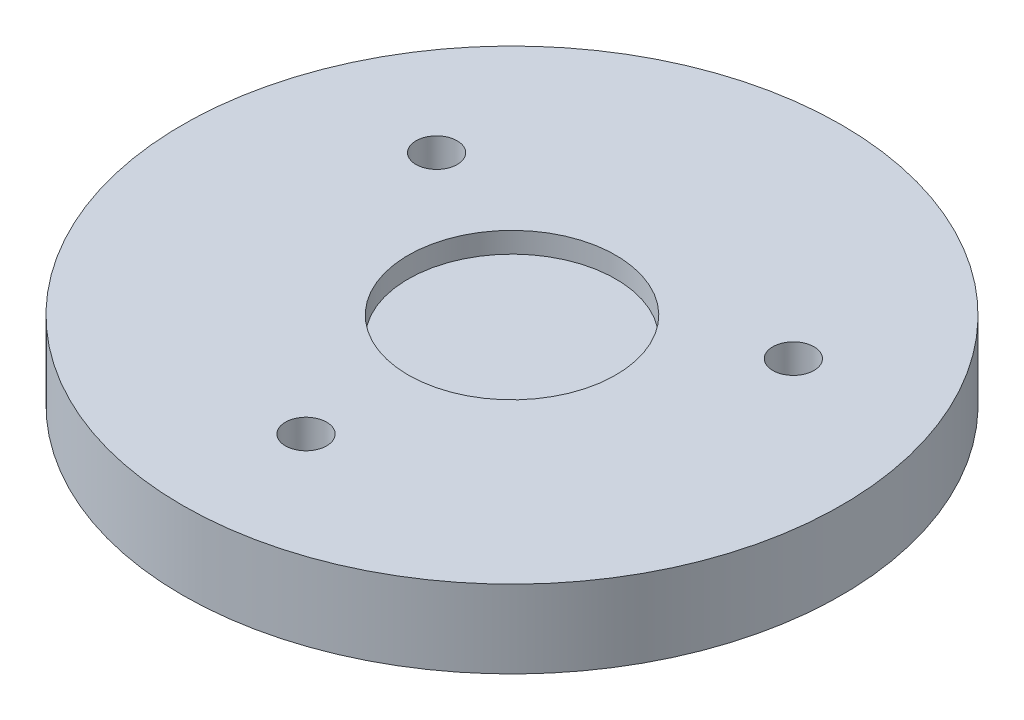
ISO-10303-21;
HEADER;
FILE_DESCRIPTION(('STEP AP214'),'2;1');
FILE_NAME('part.step','',(''),(''),'','','');
FILE_SCHEMA(('AUTOMOTIVE_DESIGN { 1 0 10303 214 1 1 1 1 }'));
ENDSEC;
DATA;
#1=APPLICATION_CONTEXT('core data for automotive mechanical design processes');
#2=APPLICATION_PROTOCOL_DEFINITION('international standard','automotive_design',2000,#1);
#3=PRODUCT_CONTEXT('',#1,'mechanical');
#4=PRODUCT('Part','Part','',(#3));
#5=PRODUCT_RELATED_PRODUCT_CATEGORY('part','',(#4));
#6=PRODUCT_DEFINITION_FORMATION('','',#4);
#7=PRODUCT_DEFINITION_CONTEXT('part definition',#1,'design');
#8=PRODUCT_DEFINITION('design','',#6,#7);
#9=PRODUCT_DEFINITION_SHAPE('','',#8);
#10=(LENGTH_UNIT() NAMED_UNIT(*) SI_UNIT(.MILLI.,.METRE.));
#11=(NAMED_UNIT(*) PLANE_ANGLE_UNIT() SI_UNIT($,.RADIAN.));
#12=(NAMED_UNIT(*) SI_UNIT($,.STERADIAN.) SOLID_ANGLE_UNIT());
#13=UNCERTAINTY_MEASURE_WITH_UNIT(LENGTH_MEASURE(1.E-05),#10,'distance_accuracy_value','');
#14=(GEOMETRIC_REPRESENTATION_CONTEXT(3) GLOBAL_UNCERTAINTY_ASSIGNED_CONTEXT((#13)) GLOBAL_UNIT_ASSIGNED_CONTEXT((#10,
#11,#12)) REPRESENTATION_CONTEXT('',''));
#15=CARTESIAN_POINT('',(0.,0.,0.));
#16=DIRECTION('',(0.,0.,1.));
#17=DIRECTION('',(1.,0.,0.));
#18=AXIS2_PLACEMENT_3D('',#15,#16,#17);
#19=CARTESIAN_POINT('',(0.,11.9888,0.));
#20=DIRECTION('',(0.,-1.,0.));
#21=DIRECTION('',(0.,0.,-1.));
#22=AXIS2_PLACEMENT_3D('',#19,#20,#21);
#23=CYLINDRICAL_SURFACE('',#22,50.8);
#24=CARTESIAN_POINT('',(0.,11.9888,0.));
#25=DIRECTION('',(0.,1.,0.));
#26=DIRECTION('',(0.,0.,1.));
#27=AXIS2_PLACEMENT_3D('',#24,#25,#26);
#28=CIRCLE('',#27,50.8);
#29=CARTESIAN_POINT('',(0.,11.9888,-50.8));
#30=VERTEX_POINT('',#29);
#31=EDGE_CURVE('E10',#30,#30,#28,.T.);
#32=CARTESIAN_POINT('',(0.,0.,0.));
#33=DIRECTION('',(0.,1.,0.));
#34=DIRECTION('',(0.,0.,1.));
#35=AXIS2_PLACEMENT_3D('',#32,#33,#34);
#36=CIRCLE('',#35,50.8);
#37=CARTESIAN_POINT('',(0.,0.,-50.8));
#38=VERTEX_POINT('',#37);
#39=EDGE_CURVE('E34',#38,#38,#36,.T.);
#40=CARTESIAN_POINT('',(0.,11.9888,-50.8));
#41=CARTESIAN_POINT('',(0.,11.8639166666667,-50.8));
#42=CARTESIAN_POINT('',(0.,11.7390333333333,-50.8));
#43=CARTESIAN_POINT('',(0.,11.4892666666667,-50.8));
#44=CARTESIAN_POINT('',(0.,11.3643833333333,-50.8));
#45=CARTESIAN_POINT('',(0.,11.1146166666667,-50.8));
#46=CARTESIAN_POINT('',(0.,10.9897333333333,-50.8));
#47=CARTESIAN_POINT('',(0.,10.7399666666667,-50.8));
#48=CARTESIAN_POINT('',(0.,10.6150833333333,-50.8));
#49=CARTESIAN_POINT('',(0.,10.3653166666667,-50.8));
#50=CARTESIAN_POINT('',(0.,10.2404333333333,-50.8));
#51=CARTESIAN_POINT('',(0.,9.99066666666667,-50.8));
#52=CARTESIAN_POINT('',(0.,9.86578333333333,-50.8));
#53=CARTESIAN_POINT('',(0.,9.61601666666667,-50.8));
#54=CARTESIAN_POINT('',(0.,9.49113333333333,-50.8));
#55=CARTESIAN_POINT('',(0.,9.24136666666667,-50.8));
#56=CARTESIAN_POINT('',(0.,9.11648333333333,-50.8));
#57=CARTESIAN_POINT('',(0.,8.86671666666667,-50.8));
#58=CARTESIAN_POINT('',(0.,8.74183333333333,-50.8));
#59=CARTESIAN_POINT('',(0.,8.49206666666666,-50.8));
#60=CARTESIAN_POINT('',(0.,8.36718333333333,-50.8));
#61=CARTESIAN_POINT('',(0.,8.11741666666667,-50.8));
#62=CARTESIAN_POINT('',(0.,7.99253333333333,-50.8));
#63=CARTESIAN_POINT('',(0.,7.74276666666667,-50.8));
#64=CARTESIAN_POINT('',(0.,7.61788333333333,-50.8));
#65=CARTESIAN_POINT('',(0.,7.36811666666667,-50.8));
#66=CARTESIAN_POINT('',(0.,7.24323333333333,-50.8));
#67=CARTESIAN_POINT('',(0.,6.99346666666667,-50.8));
#68=CARTESIAN_POINT('',(0.,6.86858333333333,-50.8));
#69=CARTESIAN_POINT('',(0.,6.61881666666666,-50.8));
#70=CARTESIAN_POINT('',(0.,6.49393333333333,-50.8));
#71=CARTESIAN_POINT('',(0.,6.24416666666666,-50.8));
#72=CARTESIAN_POINT('',(0.,6.11928333333333,-50.8));
#73=CARTESIAN_POINT('',(0.,5.86951666666667,-50.8));
#74=CARTESIAN_POINT('',(0.,5.74463333333333,-50.8));
#75=CARTESIAN_POINT('',(0.,5.49486666666667,-50.8));
#76=CARTESIAN_POINT('',(0.,5.36998333333333,-50.8));
#77=CARTESIAN_POINT('',(0.,5.12021666666667,-50.8));
#78=CARTESIAN_POINT('',(0.,4.99533333333333,-50.8));
#79=CARTESIAN_POINT('',(0.,4.74556666666667,-50.8));
#80=CARTESIAN_POINT('',(0.,4.62068333333333,-50.8));
#81=CARTESIAN_POINT('',(0.,4.37091666666667,-50.8));
#82=CARTESIAN_POINT('',(0.,4.24603333333333,-50.8));
#83=CARTESIAN_POINT('',(0.,3.99626666666667,-50.8));
#84=CARTESIAN_POINT('',(0.,3.87138333333333,-50.8));
#85=CARTESIAN_POINT('',(0.,3.62161666666667,-50.8));
#86=CARTESIAN_POINT('',(0.,3.49673333333333,-50.8));
#87=CARTESIAN_POINT('',(0.,3.24696666666667,-50.8));
#88=CARTESIAN_POINT('',(0.,3.12208333333333,-50.8));
#89=CARTESIAN_POINT('',(0.,2.87231666666667,-50.8));
#90=CARTESIAN_POINT('',(0.,2.74743333333333,-50.8));
#91=CARTESIAN_POINT('',(0.,2.49766666666667,-50.8));
#92=CARTESIAN_POINT('',(0.,2.37278333333333,-50.8));
#93=CARTESIAN_POINT('',(0.,2.12301666666667,-50.8));
#94=CARTESIAN_POINT('',(0.,1.99813333333333,-50.8));
#95=CARTESIAN_POINT('',(0.,1.74836666666667,-50.8));
#96=CARTESIAN_POINT('',(0.,1.62348333333333,-50.8));
#97=CARTESIAN_POINT('',(0.,1.37371666666667,-50.8));
#98=CARTESIAN_POINT('',(0.,1.24883333333333,-50.8));
#99=CARTESIAN_POINT('',(0.,0.999066666666667,-50.8));
#100=CARTESIAN_POINT('',(0.,0.874183333333333,-50.8));
#101=CARTESIAN_POINT('',(0.,0.624416666666667,-50.8));
#102=CARTESIAN_POINT('',(0.,0.499533333333334,-50.8));
#103=CARTESIAN_POINT('',(0.,0.249766666666667,-50.8));
#104=CARTESIAN_POINT('',(0.,0.124883333333333,-50.8));
#105=CARTESIAN_POINT('',(0.,0.,-50.8));
#106=B_SPLINE_CURVE_WITH_KNOTS('',3,(#40,#41,#42,#43,#44,#45,#46,#47,#48,#49,#50,#51,#52,#53,
#54,#55,#56,#57,#58,#59,#60,#61,#62,#63,#64,#65,#66,#67,#68,#69,#70,#71,#72,#73,#74,#75,#76,#77,
#78,#79,#80,#81,#82,#83,#84,#85,#86,#87,#88,#89,#90,#91,#92,#93,#94,#95,#96,#97,#98,#99,#100,
#101,#102,#103,#104,#105),.UNSPECIFIED.,.F.,.F.,(4,2,2,2,2,2,2,2,2,2,2,2,2,2,2,2,2,2,2,2,2,2,2,
2,2,2,2,2,2,2,2,2,4),(0.,0.374650000000001,0.749300000000001,1.12395,1.4986,1.87325,2.2479,
2.62255,2.9972,3.37185,3.7465,4.12115,4.4958,4.87045,5.2451,5.61975,5.9944,6.36905,6.7437,
7.11835,7.493,7.86765,8.2423,8.61695,8.9916,9.36625,9.7409,10.11555,10.4902,10.86485,11.2395,
11.61415,11.9888),.UNSPECIFIED.);
#107=EDGE_CURVE('BSEAM31',#30,#38,#106,.T.);
#108=ORIENTED_EDGE('',*,*,#31,.F.);
#109=ORIENTED_EDGE('',*,*,#39,.T.);
#110=ORIENTED_EDGE('',*,*,#107,.T.);
#111=ORIENTED_EDGE('',*,*,#107,.F.);
#112=EDGE_LOOP('',(#108,#110,#109,#111));
#113=FACE_BOUND('',#112,.T.);
#114=ADVANCED_FACE('F31',(#113),#23,.T.);
#115=CARTESIAN_POINT('',(0.,11.9888,0.));
#116=DIRECTION('',(0.,1.,0.));
#117=DIRECTION('',(0.,0.,1.));
#118=AXIS2_PLACEMENT_3D('',#115,#116,#117);
#119=PLANE('',#118);
#120=CARTESIAN_POINT('',(0.,11.9888,0.));
#121=DIRECTION('',(0.,1.,0.));
#122=DIRECTION('',(0.,0.,1.));
#123=AXIS2_PLACEMENT_3D('',#120,#121,#122);
#124=CIRCLE('',#123,16.002);
#125=CARTESIAN_POINT('',(0.,11.9888,16.002));
#126=VERTEX_POINT('',#125);
#127=EDGE_CURVE('E61',#126,#126,#124,.T.);
#128=ORIENTED_EDGE('',*,*,#127,.F.);
#129=EDGE_LOOP('',(#128));
#130=FACE_BOUND('',#129,.T.);
#131=CARTESIAN_POINT('',(27.4963065701561,11.9888,-15.8749999999997));
#132=DIRECTION('',(0.,-1.,0.));
#133=DIRECTION('',(-0.866025403784443,0.,0.499999999999992));
#134=AXIS2_PLACEMENT_3D('',#131,#132,#133);
#135=CIRCLE('',#134,3.175);
#136=CARTESIAN_POINT('',(27.4963065701561,11.9888,-19.0499999999997));
#137=VERTEX_POINT('',#136);
#138=EDGE_CURVE('E52',#137,#137,#135,.T.);
#139=ORIENTED_EDGE('',*,*,#138,.T.);
#140=EDGE_LOOP('',(#139));
#141=FACE_BOUND('',#140,.T.);
#142=CARTESIAN_POINT('',(-27.4963065701559,11.9888,-15.8750000000001));
#143=DIRECTION('',(0.,-1.,0.));
#144=DIRECTION('',(0.866025403784436,0.,0.500000000000004));
#145=AXIS2_PLACEMENT_3D('',#142,#143,#144);
#146=CIRCLE('',#145,3.175);
#147=CARTESIAN_POINT('',(-27.4963065701559,11.9888,-19.0500000000001));
#148=VERTEX_POINT('',#147);
#149=EDGE_CURVE('E46',#148,#148,#146,.T.);
#150=ORIENTED_EDGE('',*,*,#149,.T.);
#151=EDGE_LOOP('',(#150));
#152=FACE_BOUND('',#151,.T.);
#153=CARTESIAN_POINT('',(0.,11.9888,31.75));
#154=DIRECTION('',(0.,-1.,0.));
#155=DIRECTION('',(0.,0.,-1.));
#156=AXIS2_PLACEMENT_3D('',#153,#154,#155);
#157=CIRCLE('',#156,3.175);
#158=CARTESIAN_POINT('',(0.,11.9888,28.575));
#159=VERTEX_POINT('',#158);
#160=EDGE_CURVE('E41',#159,#159,#157,.T.);
#161=ORIENTED_EDGE('',*,*,#160,.T.);
#162=EDGE_LOOP('',(#161));
#163=FACE_BOUND('',#162,.T.);
#164=ORIENTED_EDGE('',*,*,#31,.T.);
#165=EDGE_LOOP('',(#164));
#166=FACE_BOUND('',#165,.T.);
#167=ADVANCED_FACE('F76',(#130,#141,#152,#163,#166),#119,.T.);
#168=CARTESIAN_POINT('',(0.,0.,0.));
#169=DIRECTION('',(0.,1.,0.));
#170=DIRECTION('',(0.,0.,1.));
#171=AXIS2_PLACEMENT_3D('',#168,#169,#170);
#172=PLANE('',#171);
#173=CARTESIAN_POINT('',(27.4963065701561,0.,-15.8749999999997));
#174=DIRECTION('',(0.,-1.,0.));
#175=DIRECTION('',(-0.866025403784443,0.,0.499999999999992));
#176=AXIS2_PLACEMENT_3D('',#173,#174,#175);
#177=CIRCLE('',#176,3.175);
#178=CARTESIAN_POINT('',(27.4963065701561,0.,-19.0499999999997));
#179=VERTEX_POINT('',#178);
#180=EDGE_CURVE('E55',#179,#179,#177,.T.);
#181=ORIENTED_EDGE('',*,*,#180,.F.);
#182=EDGE_LOOP('',(#181));
#183=FACE_BOUND('',#182,.T.);
#184=CARTESIAN_POINT('',(-27.4963065701559,0.,-15.8750000000001));
#185=DIRECTION('',(0.,-1.,0.));
#186=DIRECTION('',(0.866025403784436,0.,0.500000000000004));
#187=AXIS2_PLACEMENT_3D('',#184,#185,#186);
#188=CIRCLE('',#187,3.175);
#189=CARTESIAN_POINT('',(-27.4963065701559,0.,-19.0500000000001));
#190=VERTEX_POINT('',#189);
#191=EDGE_CURVE('E49',#190,#190,#188,.T.);
#192=ORIENTED_EDGE('',*,*,#191,.F.);
#193=EDGE_LOOP('',(#192));
#194=FACE_BOUND('',#193,.T.);
#195=CARTESIAN_POINT('',(0.,0.,31.75));
#196=DIRECTION('',(0.,-1.,0.));
#197=DIRECTION('',(0.,0.,-1.));
#198=AXIS2_PLACEMENT_3D('',#195,#196,#197);
#199=CIRCLE('',#198,3.175);
#200=CARTESIAN_POINT('',(0.,0.,28.575));
#201=VERTEX_POINT('',#200);
#202=EDGE_CURVE('E43',#201,#201,#199,.T.);
#203=ORIENTED_EDGE('',*,*,#202,.F.);
#204=EDGE_LOOP('',(#203));
#205=FACE_BOUND('',#204,.T.);
#206=ORIENTED_EDGE('',*,*,#39,.F.);
#207=EDGE_LOOP('',(#206));
#208=FACE_BOUND('',#207,.T.);
#209=ADVANCED_FACE('F79',(#183,#194,#205,#208),#172,.F.);
#210=CARTESIAN_POINT('',(0.,11.9888,31.75));
#211=DIRECTION('',(0.,-1.,0.));
#212=DIRECTION('',(0.,0.,-1.));
#213=AXIS2_PLACEMENT_3D('',#210,#211,#212);
#214=CYLINDRICAL_SURFACE('',#213,3.175);
#215=CARTESIAN_POINT('',(0.,11.9888,28.575));
#216=CARTESIAN_POINT('',(0.,11.8639166666667,28.575));
#217=CARTESIAN_POINT('',(0.,11.7390333333333,28.575));
#218=CARTESIAN_POINT('',(0.,11.4892666666667,28.575));
#219=CARTESIAN_POINT('',(0.,11.3643833333333,28.575));
#220=CARTESIAN_POINT('',(0.,11.1146166666667,28.575));
#221=CARTESIAN_POINT('',(0.,10.9897333333333,28.575));
#222=CARTESIAN_POINT('',(0.,10.7399666666667,28.575));
#223=CARTESIAN_POINT('',(0.,10.6150833333333,28.575));
#224=CARTESIAN_POINT('',(0.,10.3653166666667,28.575));
#225=CARTESIAN_POINT('',(0.,10.2404333333333,28.575));
#226=CARTESIAN_POINT('',(0.,9.99066666666667,28.575));
#227=CARTESIAN_POINT('',(0.,9.86578333333333,28.575));
#228=CARTESIAN_POINT('',(0.,9.61601666666667,28.575));
#229=CARTESIAN_POINT('',(0.,9.49113333333333,28.575));
#230=CARTESIAN_POINT('',(0.,9.24136666666667,28.575));
#231=CARTESIAN_POINT('',(0.,9.11648333333333,28.575));
#232=CARTESIAN_POINT('',(0.,8.86671666666667,28.575));
#233=CARTESIAN_POINT('',(0.,8.74183333333333,28.575));
#234=CARTESIAN_POINT('',(0.,8.49206666666667,28.575));
#235=CARTESIAN_POINT('',(0.,8.36718333333333,28.575));
#236=CARTESIAN_POINT('',(0.,8.11741666666667,28.575));
#237=CARTESIAN_POINT('',(0.,7.99253333333333,28.575));
#238=CARTESIAN_POINT('',(0.,7.74276666666667,28.575));
#239=CARTESIAN_POINT('',(0.,7.61788333333333,28.575));
#240=CARTESIAN_POINT('',(0.,7.36811666666667,28.575));
#241=CARTESIAN_POINT('',(0.,7.24323333333333,28.575));
#242=CARTESIAN_POINT('',(0.,6.99346666666667,28.575));
#243=CARTESIAN_POINT('',(0.,6.86858333333333,28.575));
#244=CARTESIAN_POINT('',(0.,6.61881666666667,28.575));
#245=CARTESIAN_POINT('',(0.,6.49393333333333,28.575));
#246=CARTESIAN_POINT('',(0.,6.24416666666667,28.575));
#247=CARTESIAN_POINT('',(0.,6.11928333333333,28.575));
#248=CARTESIAN_POINT('',(0.,5.86951666666667,28.575));
#249=CARTESIAN_POINT('',(0.,5.74463333333333,28.575));
#250=CARTESIAN_POINT('',(0.,5.49486666666667,28.575));
#251=CARTESIAN_POINT('',(0.,5.36998333333333,28.575));
#252=CARTESIAN_POINT('',(0.,5.12021666666667,28.575));
#253=CARTESIAN_POINT('',(0.,4.99533333333333,28.575));
#254=CARTESIAN_POINT('',(0.,4.74556666666667,28.575));
#255=CARTESIAN_POINT('',(0.,4.62068333333333,28.575));
#256=CARTESIAN_POINT('',(0.,4.37091666666667,28.575));
#257=CARTESIAN_POINT('',(0.,4.24603333333333,28.575));
#258=CARTESIAN_POINT('',(0.,3.99626666666667,28.575));
#259=CARTESIAN_POINT('',(0.,3.87138333333333,28.575));
#260=CARTESIAN_POINT('',(0.,3.62161666666667,28.575));
#261=CARTESIAN_POINT('',(0.,3.49673333333333,28.575));
#262=CARTESIAN_POINT('',(0.,3.24696666666667,28.575));
#263=CARTESIAN_POINT('',(0.,3.12208333333333,28.575));
#264=CARTESIAN_POINT('',(0.,2.87231666666667,28.575));
#265=CARTESIAN_POINT('',(0.,2.74743333333333,28.575));
#266=CARTESIAN_POINT('',(0.,2.49766666666667,28.575));
#267=CARTESIAN_POINT('',(0.,2.37278333333333,28.575));
#268=CARTESIAN_POINT('',(0.,2.12301666666667,28.575));
#269=CARTESIAN_POINT('',(0.,1.99813333333333,28.575));
#270=CARTESIAN_POINT('',(0.,1.74836666666667,28.575));
#271=CARTESIAN_POINT('',(0.,1.62348333333333,28.575));
#272=CARTESIAN_POINT('',(0.,1.37371666666667,28.575));
#273=CARTESIAN_POINT('',(0.,1.24883333333333,28.575));
#274=CARTESIAN_POINT('',(0.,0.999066666666667,28.575));
#275=CARTESIAN_POINT('',(0.,0.874183333333333,28.575));
#276=CARTESIAN_POINT('',(0.,0.624416666666667,28.575));
#277=CARTESIAN_POINT('',(0.,0.499533333333334,28.575));
#278=CARTESIAN_POINT('',(0.,0.249766666666667,28.575));
#279=CARTESIAN_POINT('',(0.,0.124883333333333,28.575));
#280=CARTESIAN_POINT('',(0.,0.,28.575));
#281=B_SPLINE_CURVE_WITH_KNOTS('',3,(#215,#216,#217,#218,#219,#220,#221,#222,#223,#224,#225,
#226,#227,#228,#229,#230,#231,#232,#233,#234,#235,#236,#237,#238,#239,#240,#241,#242,#243,#244,
#245,#246,#247,#248,#249,#250,#251,#252,#253,#254,#255,#256,#257,#258,#259,#260,#261,#262,#263,
#264,#265,#266,#267,#268,#269,#270,#271,#272,#273,#274,#275,#276,#277,#278,#279,#280),
.UNSPECIFIED.,.F.,.F.,(4,2,2,2,2,2,2,2,2,2,2,2,2,2,2,2,2,2,2,2,2,2,2,2,2,2,2,2,2,2,2,2,4),(0.,
0.374649999999999,0.7493,1.12395,1.4986,1.87325,2.2479,2.62255,2.9972,3.37185,3.7465,4.12115,
4.4958,4.87045,5.2451,5.61975,5.9944,6.36905,6.7437,7.11835,7.493,7.86765,8.2423,8.61695,8.9916,
9.36625,9.7409,10.11555,10.4902,10.86485,11.2395,11.61415,11.9888),.UNSPECIFIED.);
#282=EDGE_CURVE('BSEAM87',#159,#201,#281,.T.);
#283=ORIENTED_EDGE('',*,*,#160,.F.);
#284=ORIENTED_EDGE('',*,*,#202,.T.);
#285=ORIENTED_EDGE('',*,*,#282,.T.);
#286=ORIENTED_EDGE('',*,*,#282,.F.);
#287=EDGE_LOOP('',(#283,#285,#284,#286));
#288=FACE_BOUND('',#287,.T.);
#289=ADVANCED_FACE('F87',(#288),#214,.F.);
#290=CARTESIAN_POINT('',(-27.4963065701559,11.9888,-15.8750000000001));
#291=DIRECTION('',(0.,-1.,0.));
#292=DIRECTION('',(0.,0.,-1.));
#293=AXIS2_PLACEMENT_3D('',#290,#291,#292);
#294=CYLINDRICAL_SURFACE('',#293,3.175);
#295=CARTESIAN_POINT('',(-27.4963065701559,11.9888,-19.0500000000001));
#296=CARTESIAN_POINT('',(-27.4963065701559,11.8639166666667,-19.0500000000001));
#297=CARTESIAN_POINT('',(-27.4963065701559,11.7390333333333,-19.0500000000001));
#298=CARTESIAN_POINT('',(-27.4963065701559,11.4892666666667,-19.0500000000001));
#299=CARTESIAN_POINT('',(-27.4963065701559,11.3643833333333,-19.0500000000001));
#300=CARTESIAN_POINT('',(-27.4963065701559,11.1146166666667,-19.0500000000001));
#301=CARTESIAN_POINT('',(-27.4963065701559,10.9897333333333,-19.0500000000001));
#302=CARTESIAN_POINT('',(-27.4963065701559,10.7399666666667,-19.0500000000001));
#303=CARTESIAN_POINT('',(-27.4963065701559,10.6150833333333,-19.0500000000001));
#304=CARTESIAN_POINT('',(-27.4963065701559,10.3653166666667,-19.0500000000001));
#305=CARTESIAN_POINT('',(-27.4963065701559,10.2404333333333,-19.0500000000001));
#306=CARTESIAN_POINT('',(-27.4963065701559,9.99066666666667,-19.0500000000001));
#307=CARTESIAN_POINT('',(-27.4963065701559,9.86578333333333,-19.0500000000001));
#308=CARTESIAN_POINT('',(-27.4963065701559,9.61601666666667,-19.0500000000001));
#309=CARTESIAN_POINT('',(-27.4963065701559,9.49113333333333,-19.0500000000001));
#310=CARTESIAN_POINT('',(-27.4963065701559,9.24136666666667,-19.0500000000001));
#311=CARTESIAN_POINT('',(-27.4963065701559,9.11648333333333,-19.0500000000001));
#312=CARTESIAN_POINT('',(-27.4963065701559,8.86671666666667,-19.0500000000001));
#313=CARTESIAN_POINT('',(-27.4963065701559,8.74183333333333,-19.0500000000001));
#314=CARTESIAN_POINT('',(-27.4963065701559,8.49206666666667,-19.0500000000001));
#315=CARTESIAN_POINT('',(-27.4963065701559,8.36718333333333,-19.0500000000001));
#316=CARTESIAN_POINT('',(-27.4963065701559,8.11741666666667,-19.0500000000001));
#317=CARTESIAN_POINT('',(-27.4963065701559,7.99253333333333,-19.0500000000001));
#318=CARTESIAN_POINT('',(-27.4963065701559,7.74276666666667,-19.0500000000001));
#319=CARTESIAN_POINT('',(-27.4963065701559,7.61788333333333,-19.0500000000001));
#320=CARTESIAN_POINT('',(-27.4963065701559,7.36811666666667,-19.0500000000001));
#321=CARTESIAN_POINT('',(-27.4963065701559,7.24323333333333,-19.0500000000001));
#322=CARTESIAN_POINT('',(-27.4963065701559,6.99346666666667,-19.0500000000001));
#323=CARTESIAN_POINT('',(-27.4963065701559,6.86858333333333,-19.0500000000001));
#324=CARTESIAN_POINT('',(-27.4963065701559,6.61881666666667,-19.0500000000001));
#325=CARTESIAN_POINT('',(-27.4963065701559,6.49393333333333,-19.0500000000001));
#326=CARTESIAN_POINT('',(-27.4963065701559,6.24416666666667,-19.0500000000001));
#327=CARTESIAN_POINT('',(-27.4963065701559,6.11928333333333,-19.0500000000001));
#328=CARTESIAN_POINT('',(-27.4963065701559,5.86951666666667,-19.0500000000001));
#329=CARTESIAN_POINT('',(-27.4963065701559,5.74463333333333,-19.0500000000001));
#330=CARTESIAN_POINT('',(-27.4963065701559,5.49486666666667,-19.0500000000001));
#331=CARTESIAN_POINT('',(-27.4963065701559,5.36998333333333,-19.0500000000001));
#332=CARTESIAN_POINT('',(-27.4963065701559,5.12021666666667,-19.0500000000001));
#333=CARTESIAN_POINT('',(-27.4963065701559,4.99533333333333,-19.0500000000001));
#334=CARTESIAN_POINT('',(-27.4963065701559,4.74556666666667,-19.0500000000001));
#335=CARTESIAN_POINT('',(-27.4963065701559,4.62068333333333,-19.0500000000001));
#336=CARTESIAN_POINT('',(-27.4963065701559,4.37091666666667,-19.0500000000001));
#337=CARTESIAN_POINT('',(-27.4963065701559,4.24603333333333,-19.0500000000001));
#338=CARTESIAN_POINT('',(-27.4963065701559,3.99626666666667,-19.0500000000001));
#339=CARTESIAN_POINT('',(-27.4963065701559,3.87138333333333,-19.0500000000001));
#340=CARTESIAN_POINT('',(-27.4963065701559,3.62161666666667,-19.0500000000001));
#341=CARTESIAN_POINT('',(-27.4963065701559,3.49673333333333,-19.0500000000001));
#342=CARTESIAN_POINT('',(-27.4963065701559,3.24696666666667,-19.0500000000001));
#343=CARTESIAN_POINT('',(-27.4963065701559,3.12208333333333,-19.0500000000001));
#344=CARTESIAN_POINT('',(-27.4963065701559,2.87231666666667,-19.0500000000001));
#345=CARTESIAN_POINT('',(-27.4963065701559,2.74743333333333,-19.0500000000001));
#346=CARTESIAN_POINT('',(-27.4963065701559,2.49766666666667,-19.0500000000001));
#347=CARTESIAN_POINT('',(-27.4963065701559,2.37278333333333,-19.0500000000001));
#348=CARTESIAN_POINT('',(-27.4963065701559,2.12301666666667,-19.0500000000001));
#349=CARTESIAN_POINT('',(-27.4963065701559,1.99813333333333,-19.0500000000001));
#350=CARTESIAN_POINT('',(-27.4963065701559,1.74836666666667,-19.0500000000001));
#351=CARTESIAN_POINT('',(-27.4963065701559,1.62348333333333,-19.0500000000001));
#352=CARTESIAN_POINT('',(-27.4963065701559,1.37371666666667,-19.0500000000001));
#353=CARTESIAN_POINT('',(-27.4963065701559,1.24883333333333,-19.0500000000001));
#354=CARTESIAN_POINT('',(-27.4963065701559,0.999066666666667,-19.0500000000001));
#355=CARTESIAN_POINT('',(-27.4963065701559,0.874183333333333,-19.0500000000001));
#356=CARTESIAN_POINT('',(-27.4963065701559,0.624416666666667,-19.0500000000001));
#357=CARTESIAN_POINT('',(-27.4963065701559,0.499533333333334,-19.0500000000001));
#358=CARTESIAN_POINT('',(-27.4963065701559,0.249766666666667,-19.0500000000001));
#359=CARTESIAN_POINT('',(-27.4963065701559,0.124883333333333,-19.0500000000001));
#360=CARTESIAN_POINT('',(-27.4963065701559,0.,-19.0500000000001));
#361=B_SPLINE_CURVE_WITH_KNOTS('',3,(#295,#296,#297,#298,#299,#300,#301,#302,#303,#304,#305,
#306,#307,#308,#309,#310,#311,#312,#313,#314,#315,#316,#317,#318,#319,#320,#321,#322,#323,#324,
#325,#326,#327,#328,#329,#330,#331,#332,#333,#334,#335,#336,#337,#338,#339,#340,#341,#342,#343,
#344,#345,#346,#347,#348,#349,#350,#351,#352,#353,#354,#355,#356,#357,#358,#359,#360),
.UNSPECIFIED.,.F.,.F.,(4,2,2,2,2,2,2,2,2,2,2,2,2,2,2,2,2,2,2,2,2,2,2,2,2,2,2,2,2,2,2,2,4),(0.,
0.374649999999999,0.7493,1.12395,1.4986,1.87325,2.2479,2.62255,2.9972,3.37185,3.7465,4.12115,
4.4958,4.87045,5.2451,5.61975,5.9944,6.36905,6.7437,7.11835,7.493,7.86765,8.2423,8.61695,8.9916,
9.36625,9.7409,10.11555,10.4902,10.86485,11.2395,11.61415,11.9888),.UNSPECIFIED.);
#362=EDGE_CURVE('BSEAM90',#148,#190,#361,.T.);
#363=ORIENTED_EDGE('',*,*,#149,.F.);
#364=ORIENTED_EDGE('',*,*,#191,.T.);
#365=ORIENTED_EDGE('',*,*,#362,.T.);
#366=ORIENTED_EDGE('',*,*,#362,.F.);
#367=EDGE_LOOP('',(#363,#365,#364,#366));
#368=FACE_BOUND('',#367,.T.);
#369=ADVANCED_FACE('F90',(#368),#294,.F.);
#370=CARTESIAN_POINT('',(27.4963065701561,11.9888,-15.8749999999997));
#371=DIRECTION('',(0.,-1.,0.));
#372=DIRECTION('',(0.,0.,-1.));
#373=AXIS2_PLACEMENT_3D('',#370,#371,#372);
#374=CYLINDRICAL_SURFACE('',#373,3.175);
#375=CARTESIAN_POINT('',(27.4963065701561,11.9888,-19.0499999999997));
#376=CARTESIAN_POINT('',(27.4963065701561,11.8639166666667,-19.0499999999997));
#377=CARTESIAN_POINT('',(27.4963065701561,11.7390333333333,-19.0499999999997));
#378=CARTESIAN_POINT('',(27.4963065701561,11.4892666666667,-19.0499999999997));
#379=CARTESIAN_POINT('',(27.4963065701561,11.3643833333333,-19.0499999999997));
#380=CARTESIAN_POINT('',(27.4963065701561,11.1146166666667,-19.0499999999997));
#381=CARTESIAN_POINT('',(27.4963065701561,10.9897333333333,-19.0499999999997));
#382=CARTESIAN_POINT('',(27.4963065701561,10.7399666666667,-19.0499999999997));
#383=CARTESIAN_POINT('',(27.4963065701561,10.6150833333333,-19.0499999999997));
#384=CARTESIAN_POINT('',(27.4963065701561,10.3653166666667,-19.0499999999997));
#385=CARTESIAN_POINT('',(27.4963065701561,10.2404333333333,-19.0499999999997));
#386=CARTESIAN_POINT('',(27.4963065701561,9.99066666666667,-19.0499999999997));
#387=CARTESIAN_POINT('',(27.4963065701561,9.86578333333333,-19.0499999999997));
#388=CARTESIAN_POINT('',(27.4963065701561,9.61601666666667,-19.0499999999997));
#389=CARTESIAN_POINT('',(27.4963065701561,9.49113333333333,-19.0499999999997));
#390=CARTESIAN_POINT('',(27.4963065701561,9.24136666666667,-19.0499999999997));
#391=CARTESIAN_POINT('',(27.4963065701561,9.11648333333333,-19.0499999999997));
#392=CARTESIAN_POINT('',(27.4963065701561,8.86671666666667,-19.0499999999997));
#393=CARTESIAN_POINT('',(27.4963065701561,8.74183333333333,-19.0499999999997));
#394=CARTESIAN_POINT('',(27.4963065701561,8.49206666666667,-19.0499999999997));
#395=CARTESIAN_POINT('',(27.4963065701561,8.36718333333333,-19.0499999999997));
#396=CARTESIAN_POINT('',(27.4963065701561,8.11741666666667,-19.0499999999997));
#397=CARTESIAN_POINT('',(27.4963065701561,7.99253333333333,-19.0499999999997));
#398=CARTESIAN_POINT('',(27.4963065701561,7.74276666666667,-19.0499999999997));
#399=CARTESIAN_POINT('',(27.4963065701561,7.61788333333333,-19.0499999999997));
#400=CARTESIAN_POINT('',(27.4963065701561,7.36811666666667,-19.0499999999997));
#401=CARTESIAN_POINT('',(27.4963065701561,7.24323333333333,-19.0499999999997));
#402=CARTESIAN_POINT('',(27.4963065701561,6.99346666666667,-19.0499999999997));
#403=CARTESIAN_POINT('',(27.4963065701561,6.86858333333333,-19.0499999999997));
#404=CARTESIAN_POINT('',(27.4963065701561,6.61881666666667,-19.0499999999997));
#405=CARTESIAN_POINT('',(27.4963065701561,6.49393333333333,-19.0499999999997));
#406=CARTESIAN_POINT('',(27.4963065701561,6.24416666666667,-19.0499999999997));
#407=CARTESIAN_POINT('',(27.4963065701561,6.11928333333333,-19.0499999999997));
#408=CARTESIAN_POINT('',(27.4963065701561,5.86951666666667,-19.0499999999997));
#409=CARTESIAN_POINT('',(27.4963065701561,5.74463333333333,-19.0499999999997));
#410=CARTESIAN_POINT('',(27.4963065701561,5.49486666666667,-19.0499999999997));
#411=CARTESIAN_POINT('',(27.4963065701561,5.36998333333333,-19.0499999999997));
#412=CARTESIAN_POINT('',(27.4963065701561,5.12021666666667,-19.0499999999997));
#413=CARTESIAN_POINT('',(27.4963065701561,4.99533333333333,-19.0499999999997));
#414=CARTESIAN_POINT('',(27.4963065701561,4.74556666666667,-19.0499999999997));
#415=CARTESIAN_POINT('',(27.4963065701561,4.62068333333333,-19.0499999999997));
#416=CARTESIAN_POINT('',(27.4963065701561,4.37091666666667,-19.0499999999997));
#417=CARTESIAN_POINT('',(27.4963065701561,4.24603333333333,-19.0499999999997));
#418=CARTESIAN_POINT('',(27.4963065701561,3.99626666666667,-19.0499999999997));
#419=CARTESIAN_POINT('',(27.4963065701561,3.87138333333333,-19.0499999999997));
#420=CARTESIAN_POINT('',(27.4963065701561,3.62161666666667,-19.0499999999997));
#421=CARTESIAN_POINT('',(27.4963065701561,3.49673333333333,-19.0499999999997));
#422=CARTESIAN_POINT('',(27.4963065701561,3.24696666666667,-19.0499999999997));
#423=CARTESIAN_POINT('',(27.4963065701561,3.12208333333333,-19.0499999999997));
#424=CARTESIAN_POINT('',(27.4963065701561,2.87231666666667,-19.0499999999997));
#425=CARTESIAN_POINT('',(27.4963065701561,2.74743333333333,-19.0499999999997));
#426=CARTESIAN_POINT('',(27.4963065701561,2.49766666666667,-19.0499999999997));
#427=CARTESIAN_POINT('',(27.4963065701561,2.37278333333333,-19.0499999999997));
#428=CARTESIAN_POINT('',(27.4963065701561,2.12301666666667,-19.0499999999997));
#429=CARTESIAN_POINT('',(27.4963065701561,1.99813333333333,-19.0499999999997));
#430=CARTESIAN_POINT('',(27.4963065701561,1.74836666666667,-19.0499999999997));
#431=CARTESIAN_POINT('',(27.4963065701561,1.62348333333333,-19.0499999999997));
#432=CARTESIAN_POINT('',(27.4963065701561,1.37371666666667,-19.0499999999997));
#433=CARTESIAN_POINT('',(27.4963065701561,1.24883333333333,-19.0499999999997));
#434=CARTESIAN_POINT('',(27.4963065701561,0.999066666666667,-19.0499999999997));
#435=CARTESIAN_POINT('',(27.4963065701561,0.874183333333333,-19.0499999999997));
#436=CARTESIAN_POINT('',(27.4963065701561,0.624416666666667,-19.0499999999997));
#437=CARTESIAN_POINT('',(27.4963065701561,0.499533333333334,-19.0499999999997));
#438=CARTESIAN_POINT('',(27.4963065701561,0.249766666666667,-19.0499999999997));
#439=CARTESIAN_POINT('',(27.4963065701561,0.124883333333333,-19.0499999999997));
#440=CARTESIAN_POINT('',(27.4963065701561,0.,-19.0499999999997));
#441=B_SPLINE_CURVE_WITH_KNOTS('',3,(#375,#376,#377,#378,#379,#380,#381,#382,#383,#384,#385,
#386,#387,#388,#389,#390,#391,#392,#393,#394,#395,#396,#397,#398,#399,#400,#401,#402,#403,#404,
#405,#406,#407,#408,#409,#410,#411,#412,#413,#414,#415,#416,#417,#418,#419,#420,#421,#422,#423,
#424,#425,#426,#427,#428,#429,#430,#431,#432,#433,#434,#435,#436,#437,#438,#439,#440),
.UNSPECIFIED.,.F.,.F.,(4,2,2,2,2,2,2,2,2,2,2,2,2,2,2,2,2,2,2,2,2,2,2,2,2,2,2,2,2,2,2,2,4),(0.,
0.374649999999999,0.7493,1.12395,1.4986,1.87325,2.2479,2.62255,2.9972,3.37185,3.7465,4.12115,
4.4958,4.87045,5.2451,5.61975,5.9944,6.36905,6.7437,7.11835,7.493,7.86765,8.2423,8.61695,8.9916,
9.36625,9.7409,10.11555,10.4902,10.86485,11.2395,11.61415,11.9888),.UNSPECIFIED.);
#442=EDGE_CURVE('BSEAM72',#137,#179,#441,.T.);
#443=ORIENTED_EDGE('',*,*,#138,.F.);
#444=ORIENTED_EDGE('',*,*,#180,.T.);
#445=ORIENTED_EDGE('',*,*,#442,.T.);
#446=ORIENTED_EDGE('',*,*,#442,.F.);
#447=EDGE_LOOP('',(#443,#445,#444,#446));
#448=FACE_BOUND('',#447,.T.);
#449=ADVANCED_FACE('F72',(#448),#374,.F.);
#450=CARTESIAN_POINT('',(0.,8.8138,0.));
#451=DIRECTION('',(0.,1.,0.));
#452=DIRECTION('',(0.,0.,1.));
#453=AXIS2_PLACEMENT_3D('',#450,#451,#452);
#454=CYLINDRICAL_SURFACE('',#453,16.002);
#455=CARTESIAN_POINT('',(0.,8.8138,0.));
#456=DIRECTION('',(0.,1.,0.));
#457=DIRECTION('',(0.,0.,1.));
#458=AXIS2_PLACEMENT_3D('',#455,#456,#457);
#459=CIRCLE('',#458,16.002);
#460=CARTESIAN_POINT('',(0.,8.8138,16.002));
#461=VERTEX_POINT('',#460);
#462=EDGE_CURVE('E58',#461,#461,#459,.T.);
#463=ORIENTED_EDGE('',*,*,#462,.F.);
#464=EDGE_LOOP('',(#463));
#465=FACE_BOUND('',#464,.T.);
#466=ORIENTED_EDGE('',*,*,#127,.T.);
#467=EDGE_LOOP('',(#466));
#468=FACE_BOUND('',#467,.T.);
#469=ADVANCED_FACE('F69',(#465,#468),#454,.F.);
#470=CARTESIAN_POINT('',(0.,8.8138,0.));
#471=DIRECTION('',(0.,1.,0.));
#472=DIRECTION('',(0.,0.,1.));
#473=AXIS2_PLACEMENT_3D('',#470,#471,#472);
#474=PLANE('',#473);
#475=ORIENTED_EDGE('',*,*,#462,.T.);
#476=EDGE_LOOP('',(#475));
#477=FACE_BOUND('',#476,.T.);
#478=ADVANCED_FACE('F67',(#477),#474,.T.);
#479=CLOSED_SHELL('',(#114,#167,#209,#289,#369,#449,#469,#478));
#480=MANIFOLD_SOLID_BREP('B2',#479);
#481=ADVANCED_BREP_SHAPE_REPRESENTATION('',(#18,#480),#14);
#482=SHAPE_DEFINITION_REPRESENTATION(#9,#481);
ENDSEC;
END-ISO-10303-21;
